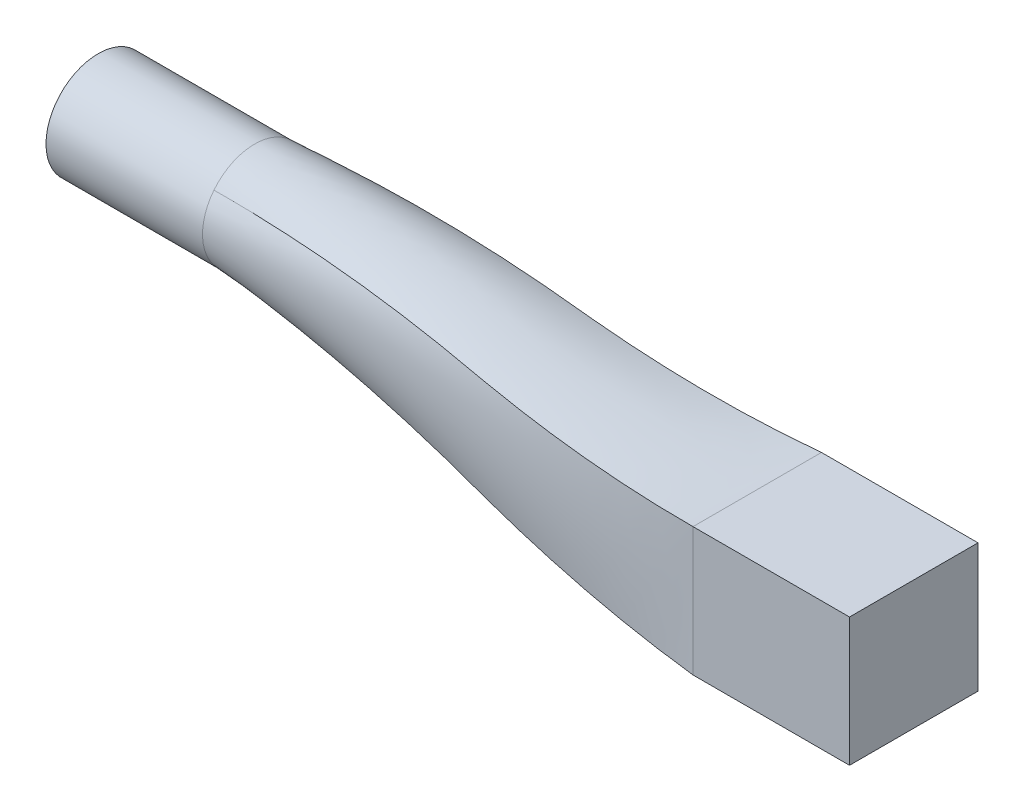
ISO-10303-21;
HEADER;
FILE_DESCRIPTION(('STEP AP214'),'2;1');
FILE_NAME('part.step','',(''),(''),'','','');
FILE_SCHEMA(('AUTOMOTIVE_DESIGN { 1 0 10303 214 1 1 1 1 }'));
ENDSEC;
DATA;
#1=APPLICATION_CONTEXT('core data for automotive mechanical design processes');
#2=APPLICATION_PROTOCOL_DEFINITION('international standard','automotive_design',2000,#1);
#3=PRODUCT_CONTEXT('',#1,'mechanical');
#4=PRODUCT('Part','Part','',(#3));
#5=PRODUCT_RELATED_PRODUCT_CATEGORY('part','',(#4));
#6=PRODUCT_DEFINITION_FORMATION('','',#4);
#7=PRODUCT_DEFINITION_CONTEXT('part definition',#1,'design');
#8=PRODUCT_DEFINITION('design','',#6,#7);
#9=PRODUCT_DEFINITION_SHAPE('','',#8);
#10=(LENGTH_UNIT() NAMED_UNIT(*) SI_UNIT(.MILLI.,.METRE.));
#11=(NAMED_UNIT(*) PLANE_ANGLE_UNIT() SI_UNIT($,.RADIAN.));
#12=(NAMED_UNIT(*) SI_UNIT($,.STERADIAN.) SOLID_ANGLE_UNIT());
#13=UNCERTAINTY_MEASURE_WITH_UNIT(LENGTH_MEASURE(1.E-05),#10,'distance_accuracy_value','');
#14=(GEOMETRIC_REPRESENTATION_CONTEXT(3) GLOBAL_UNCERTAINTY_ASSIGNED_CONTEXT((#13)) GLOBAL_UNIT_ASSIGNED_CONTEXT((#10,
#11,#12)) REPRESENTATION_CONTEXT('',''));
#15=CARTESIAN_POINT('',(0.,0.,0.));
#16=DIRECTION('',(0.,0.,1.));
#17=DIRECTION('',(1.,0.,0.));
#18=AXIS2_PLACEMENT_3D('',#15,#16,#17);
#19=CARTESIAN_POINT('',(1021.37315576226,9.46789488822745,125.73));
#20=CARTESIAN_POINT('',(869.226053043045,1.69605899662091,118.667809974565));
#21=CARTESIAN_POINT('',(717.318679962298,10.4442464754096,111.605619949131));
#22=CARTESIAN_POINT('',(393.85544304639,64.742678185285,96.2732707473336));
#23=CARTESIAN_POINT('',(215.92105118721,74.697777747955,88.0031115709713));
#24=CARTESIAN_POINT('',(37.7577690383184,65.0138389138323,79.732952394609));
#25=CARTESIAN_POINT('',(1021.37315576226,9.46789488822746,114.726095999935));
#26=CARTESIAN_POINT('',(869.226053043045,2.56991933839645,108.654310073217));
#27=CARTESIAN_POINT('',(717.318679962298,12.1919671589607,102.582524146498));
#28=CARTESIAN_POINT('',(393.85544304639,68.3875910805225,89.4003891753731));
#29=CARTESIAN_POINT('',(215.921051187211,79.3660225131033,82.2900401309673));
#30=CARTESIAN_POINT('',(37.7577690383184,70.7054155488915,75.1796910865616));
#31=CARTESIAN_POINT('',(1021.37315576226,9.46789488822746,93.2899023629017));
#32=CARTESIAN_POINT('',(869.226053043046,4.20482678057518,88.8924909485093));
#33=CARTESIAN_POINT('',(717.318679962299,15.4617820433182,84.4950795341169));
#34=CARTESIAN_POINT('',(393.85544304639,75.2068674953431,74.9480909729756));
#35=CARTESIAN_POINT('',(215.921051187211,88.0998530162083,69.7985138262266));
#36=CARTESIAN_POINT('',(37.7577690383183,81.353800140281,64.6489366794776));
#37=CARTESIAN_POINT('',(1021.37315576226,9.46789488822747,67.2687703282233));
#38=CARTESIAN_POINT('',(869.226053043045,5.79694830069594,64.3707141628556));
#39=CARTESIAN_POINT('',(717.318679962298,18.6460250835597,61.4726579974879));
#40=CARTESIAN_POINT('',(393.85544304639,81.8476818017599,55.1808407320494));
#41=CARTESIAN_POINT('',(215.92105118721,96.6051170686796,51.7870796319785));
#42=CARTESIAN_POINT('',(37.7577690383184,91.7235139388067,48.3933185319076));
#43=CARTESIAN_POINT('',(1021.37315576226,9.46789488822747,46.6247399734059));
#44=CARTESIAN_POINT('',(869.226053043045,6.71549396971209,44.7015810673591));
#45=CARTESIAN_POINT('',(717.318679962298,20.483116421592,42.7784221613122));
#46=CARTESIAN_POINT('',(393.85544304639,85.6789793144252,38.6031530433955));
#47=CARTESIAN_POINT('',(215.92105118721,101.512075086962,36.3510428315258));
#48=CARTESIAN_POINT('',(37.7577690383184,97.7061324627059,34.098932619656));
#49=CARTESIAN_POINT('',(1021.37315576226,9.46789488822747,31.1622427577088));
#50=CARTESIAN_POINT('',(869.226053043045,7.21450020940481,29.8971548567502));
#51=CARTESIAN_POINT('',(717.318679962298,21.4811289009774,28.6320669557916));
#52=CARTESIAN_POINT('',(393.85544304639,87.7603579866332,25.8855011739862));
#53=CARTESIAN_POINT('',(215.92105118721,104.1778137123,24.4040232931395));
#54=CARTESIAN_POINT('',(37.7577690383184,100.956231041174,22.9225454122928));
#55=CARTESIAN_POINT('',(1021.37315576226,9.46789488822748,15.6543590063811));
#56=CARTESIAN_POINT('',(869.226053043045,7.51403559640918,15.0135671191708));
#57=CARTESIAN_POINT('',(717.318679962298,22.0801996749861,14.3727752319605));
#58=CARTESIAN_POINT('',(393.85544304639,89.0097342799364,12.9815856795693));
#59=CARTESIAN_POINT('',(215.92105118721,105.777960137893,12.2311880143883));
#60=CARTESIAN_POINT('',(37.7577690383184,102.907147599057,11.4807903492074));
#61=CARTESIAN_POINT('',(1021.37315576226,9.46789488822748,5.23875000000003));
#62=CARTESIAN_POINT('',(869.226053043045,7.57979946099008,5.01973399129957));
#63=CARTESIAN_POINT('',(717.318679962298,22.2117274041479,4.80071798259912));
#64=CARTESIAN_POINT('',(393.85544304639,89.284038475461,4.32522384918086));
#65=CARTESIAN_POINT('',(215.92105118721,106.129276935199,4.06874572446306));
#66=CARTESIAN_POINT('',(37.7577690383184,103.335476998145,3.81226759974525));
#67=CARTESIAN_POINT('',(1021.37315576226,9.46789488822748,-5.23875));
#68=CARTESIAN_POINT('',(869.226053043045,7.57979946099008,-5.01973399129955));
#69=CARTESIAN_POINT('',(717.318679962298,22.2117274041479,-4.8007179825991));
#70=CARTESIAN_POINT('',(393.85544304639,89.2840384754609,-4.32522384918085));
#71=CARTESIAN_POINT('',(215.92105118721,106.129276935199,-4.06874572446304));
#72=CARTESIAN_POINT('',(37.7577690383184,103.335476998145,-3.81226759974524));
#73=CARTESIAN_POINT('',(1021.37315576226,9.46789488822748,-15.654359006381));
#74=CARTESIAN_POINT('',(869.226053043045,7.51403559640918,-15.0135671191708));
#75=CARTESIAN_POINT('',(717.318679962298,22.0801996749861,-14.3727752319605));
#76=CARTESIAN_POINT('',(393.85544304639,89.0097342799364,-12.9815856795693));
#77=CARTESIAN_POINT('',(215.92105118721,105.777960137893,-12.2311880143883));
#78=CARTESIAN_POINT('',(37.7577690383184,102.907147599057,-11.4807903492073));
#79=CARTESIAN_POINT('',(1021.37315576226,9.46789488822748,-31.1622427577088));
#80=CARTESIAN_POINT('',(869.226053043045,7.21450020940484,-29.8971548567502));
#81=CARTESIAN_POINT('',(717.318679962298,21.4811289009774,-28.6320669557916));
#82=CARTESIAN_POINT('',(393.85544304639,87.7603579866333,-25.8855011739863));
#83=CARTESIAN_POINT('',(215.92105118721,104.1778137123,-24.4040232931396));
#84=CARTESIAN_POINT('',(37.7577690383184,100.956231041174,-22.9225454122929));
#85=CARTESIAN_POINT('',(1021.37315576226,9.46789488822749,-46.6247399734059));
#86=CARTESIAN_POINT('',(869.226053043045,6.71549396971209,-44.701581067359));
#87=CARTESIAN_POINT('',(717.318679962298,20.4831164215919,-42.7784221613121));
#88=CARTESIAN_POINT('',(393.85544304639,85.6789793144252,-38.6031530433955));
#89=CARTESIAN_POINT('',(215.92105118721,101.512075086962,-36.3510428315257));
#90=CARTESIAN_POINT('',(37.7577690383184,97.7061324627059,-34.0989326196559));
#91=CARTESIAN_POINT('',(1021.37315576226,9.4678948882275,-67.2687703282233));
#92=CARTESIAN_POINT('',(869.226053043045,5.79694830069598,-64.3707141628556));
#93=CARTESIAN_POINT('',(717.318679962298,18.6460250835597,-61.472657997488));
#94=CARTESIAN_POINT('',(393.85544304639,81.84768180176,-55.1808407320494));
#95=CARTESIAN_POINT('',(215.921051187211,96.6051170686797,-51.7870796319786));
#96=CARTESIAN_POINT('',(37.7577690383184,91.7235139388069,-48.3933185319077));
#97=CARTESIAN_POINT('',(1021.37315576226,9.46789488822749,-93.2899023629016));
#98=CARTESIAN_POINT('',(869.226053043044,4.2048267805752,-88.8924909485093));
#99=CARTESIAN_POINT('',(717.318679962297,15.4617820433182,-84.4950795341169));
#100=CARTESIAN_POINT('',(393.855443046389,75.2068674953431,-74.9480909729755));
#101=CARTESIAN_POINT('',(215.92105118721,88.0998530162083,-69.7985138262265));
#102=CARTESIAN_POINT('',(37.7577690383183,81.3538001402809,-64.6489366794775));
#103=CARTESIAN_POINT('',(1021.37315576226,9.4678948882275,-114.726095999935));
#104=CARTESIAN_POINT('',(869.226053043045,2.56991933839648,-108.654310073217));
#105=CARTESIAN_POINT('',(717.318679962298,12.1919671589607,-102.582524146498));
#106=CARTESIAN_POINT('',(393.85544304639,68.3875910805225,-89.400389175373));
#107=CARTESIAN_POINT('',(215.92105118721,79.3660225131033,-82.2900401309673));
#108=CARTESIAN_POINT('',(37.7577690383184,70.7054155488916,-75.1796910865615));
#109=CARTESIAN_POINT('',(1021.37315576226,9.46789488822752,-125.73));
#110=CARTESIAN_POINT('',(869.226053043045,1.69605899662097,-118.667809974565));
#111=CARTESIAN_POINT('',(717.318679962298,10.4442464754097,-111.605619949131));
#112=CARTESIAN_POINT('',(393.85544304639,64.7426781852851,-96.2732707473335));
#113=CARTESIAN_POINT('',(215.92105118721,74.697777747955,-88.0031115709712));
#114=CARTESIAN_POINT('',(37.7577690383184,65.0138389138323,-79.7329523946089));
#115=B_SPLINE_SURFACE_WITH_KNOTS('',3,3,((#19,#20,#21,#22,#23,#24),(#25,#26,#27,#28,#29,#30),
(#31,#32,#33,#34,#35,#36),(#37,#38,#39,#40,#41,#42),(#43,#44,#45,#46,#47,#48),(#49,#50,#51,#52,
#53,#54),(#55,#56,#57,#58,#59,#60),(#61,#62,#63,#64,#65,#66),(#67,#68,#69,#70,#71,#72),(#73,#74,
#75,#76,#77,#78),(#79,#80,#81,#82,#83,#84),(#85,#86,#87,#88,#89,#90),(#91,#92,#93,#94,#95,#96),
(#97,#98,#99,#100,#101,#102),(#103,#104,#105,#106,#107,#108),(#109,#110,#111,#112,#113,#114)),
.UNSPECIFIED.,.F.,.F.,.F.,(4,1,1,1,1,1,2,1,1,1,1,1,4),(4,2,4),(0.732388356261361,
0.765839811728691,0.799291267196021,0.816016994929686,0.832742722663351,0.849468450397016,
0.866194178130681,0.882919905864346,0.899645633598011,0.916371361331676,0.93309708906534,
0.96654854453267,1.),(0.,0.460607173270421,1.),.UNSPECIFIED.);
#116=DIRECTION('',(0.,0.,1.));
#117=VECTOR('',#116,1.);
#118=CARTESIAN_POINT('',(1021.37315576226,9.46789488822745,125.73));
#119=LINE('',#118,#117);
#120=CARTESIAN_POINT('',(1021.37315576226,9.46789488822752,-125.73));
#121=VERTEX_POINT('',#120);
#122=CARTESIAN_POINT('',(1021.37315576226,9.46789488822745,125.73));
#123=VERTEX_POINT('',#122);
#124=EDGE_CURVE('E209',#121,#123,#119,.T.);
#125=CARTESIAN_POINT('',(1021.37315576226,9.46789488822752,-125.73));
#126=CARTESIAN_POINT('',(869.226053043045,1.69605899662097,-118.667809974565));
#127=CARTESIAN_POINT('',(717.318679962298,10.4442464754097,-111.605619949131));
#128=CARTESIAN_POINT('',(393.85544304639,64.7426781852851,-96.2732707473335));
#129=CARTESIAN_POINT('',(215.92105118721,74.697777747955,-88.0031115709712));
#130=CARTESIAN_POINT('',(37.7577690383184,65.0138389138323,-79.7329523946089));
#131=B_SPLINE_CURVE_WITH_KNOTS('',3,(#125,#126,#127,#128,#129,#130),.UNSPECIFIED.,.F.,.F.,(4,2,
4),(0.,0.460607173270421,1.),.UNSPECIFIED.);
#132=CARTESIAN_POINT('',(37.7577690383183,65.0141999016754,-79.7334037330846));
#133=VERTEX_POINT('',#132);
#134=EDGE_CURVE('E375',#121,#133,#131,.T.);
#135=CARTESIAN_POINT('',(37.7577690383184,1.22747699814517,0.));
#136=DIRECTION('',(-1.,0.,0.));
#137=DIRECTION('',(0.,0.,1.));
#138=AXIS2_PLACEMENT_3D('',#135,#136,#137);
#139=CIRCLE('',#138,102.108);
#140=CARTESIAN_POINT('',(37.7577690383183,65.0141969914088,79.733400107363));
#141=VERTEX_POINT('',#140);
#142=EDGE_CURVE('E13',#141,#133,#139,.T.);
#143=CARTESIAN_POINT('',(1021.37315576226,9.46789488822745,125.73));
#144=CARTESIAN_POINT('',(869.226053043045,1.69605899662091,118.667809974565));
#145=CARTESIAN_POINT('',(717.318679962298,10.4442464754096,111.605619949131));
#146=CARTESIAN_POINT('',(393.85544304639,64.742678185285,96.2732707473336));
#147=CARTESIAN_POINT('',(215.92105118721,74.697777747955,88.0031115709713));
#148=CARTESIAN_POINT('',(37.7577690383184,65.0138389138323,79.732952394609));
#149=B_SPLINE_CURVE_WITH_KNOTS('',3,(#143,#144,#145,#146,#147,#148),.UNSPECIFIED.,.F.,.F.,(4,2,
4),(0.,0.460607173270421,1.),.UNSPECIFIED.);
#150=EDGE_CURVE('E370',#123,#141,#149,.T.);
#151=ORIENTED_EDGE('',*,*,#124,.F.);
#152=ORIENTED_EDGE('',*,*,#134,.T.);
#153=ORIENTED_EDGE('',*,*,#142,.F.);
#154=ORIENTED_EDGE('',*,*,#150,.F.);
#155=EDGE_LOOP('',(#151,#152,#153,#154));
#156=FACE_BOUND('',#155,.T.);
#157=ADVANCED_FACE('F115',(#156),#115,.T.);
#158=CARTESIAN_POINT('',(1021.37315576226,-241.992105111773,125.73));
#159=CARTESIAN_POINT('',(869.226053043045,-232.992911450681,116.462268723041));
#160=CARTESIAN_POINT('',(717.318679962298,-207.473694419194,107.194537446083));
#161=CARTESIAN_POINT('',(393.85544304639,-116.764562820257,87.0738536730629));
#162=CARTESIAN_POINT('',(215.92105118721,-87.1697929212242,76.2209011770018));
#163=CARTESIAN_POINT('',(37.7577690383184,-77.2140614189837,65.3679486809407));
#164=CARTESIAN_POINT('',(1021.37315576226,-231.514605111773,125.73));
#165=CARTESIAN_POINT('',(869.226053043045,-223.475569184842,117.240484105224));
#166=CARTESIAN_POINT('',(717.318679962298,-198.916509887516,108.750968210449));
#167=CARTESIAN_POINT('',(393.85544304639,-110.291926228516,90.3198269095048));
#168=CARTESIAN_POINT('',(215.92105118721,-81.8215465352591,80.3782015033363));
#169=CARTESIAN_POINT('',(37.7577690383184,-72.9902052387945,70.4365760971678));
#170=CARTESIAN_POINT('',(1021.37315576226,-210.559605111773,125.73));
#171=CARTESIAN_POINT('',(869.226053043045,-204.289612272191,118.670824649608));
#172=CARTESIAN_POINT('',(717.318679962298,-181.499596062214,111.611649299217));
#173=CARTESIAN_POINT('',(393.85544304639,-96.7156887756388,96.285845099795));
#174=CARTESIAN_POINT('',(215.92105118721,-70.3169423674572,88.0192162507648));
#175=CARTESIAN_POINT('',(37.7577690383184,-63.5572343560682,79.7525874017347));
#176=CARTESIAN_POINT('',(1021.37315576226,-179.127105111773,125.73));
#177=CARTESIAN_POINT('',(869.226053043045,-175.137961616093,120.357579315639));
#178=CARTESIAN_POINT('',(717.318679962298,-154.628794750018,114.985158631278));
#179=CARTESIAN_POINT('',(393.85544304639,-74.796719471849,103.321378742191));
#180=CARTESIAN_POINT('',(215.92105118721,-51.0689557281716,97.030019537465));
#181=CARTESIAN_POINT('',(37.7577690383184,-46.9802303812868,90.7386603327387));
#182=CARTESIAN_POINT('',(1021.37315576226,-147.694605111773,125.73));
#183=CARTESIAN_POINT('',(869.226053043045,-145.70909192138,121.522482711295));
#184=CARTESIAN_POINT('',(717.318679962298,-127.203555360593,117.314965422591));
#185=CARTESIAN_POINT('',(393.85544304639,-51.7214564213965,108.180246006846));
#186=CARTESIAN_POINT('',(215.92105118721,-30.3400387114043,103.253043879806));
#187=CARTESIAN_POINT('',(37.7577690383183,-28.5976593982048,98.3258417527663));
#188=CARTESIAN_POINT('',(1021.37315576226,-116.262105111772,125.73));
#189=CARTESIAN_POINT('',(869.226053043045,-116.108663276148,122.121846326112));
#190=CARTESIAN_POINT('',(717.318679962298,-99.4351980701293,118.513692652223));
#191=CARTESIAN_POINT('',(393.85544304639,-27.9306128586505,110.680220046338));
#192=CARTESIAN_POINT('',(215.92105118721,-8.69463752160761,106.454901114341));
#193=CARTESIAN_POINT('',(37.7577690383184,-9.09770058135737,102.229582182343));
#194=CARTESIAN_POINT('',(1021.37315576226,-84.8296051117725,125.73));
#195=CARTESIAN_POINT('',(869.226053043045,-86.4488513176859,122.133255762567));
#196=CARTESIAN_POINT('',(717.318679962298,-71.5480741532042,118.536511525134));
#197=CARTESIAN_POINT('',(393.85544304639,-3.89207868241689,110.727809346453));
#198=CARTESIAN_POINT('',(215.92105118721,13.2679949554719,106.515851405205));
#199=CARTESIAN_POINT('',(37.7577690383184,10.7890301965681,102.303893463957));
#200=CARTESIAN_POINT('',(1021.37315576226,-53.3971051117726,125.73));
#201=CARTESIAN_POINT('',(869.226053043045,-56.8440481739013,121.55624209655));
#202=CARTESIAN_POINT('',(717.318679962298,-43.7709678656349,117.3824841931));
#203=CARTESIAN_POINT('',(393.85544304639,19.9170111210882,108.321058002501));
#204=CARTESIAN_POINT('',(215.921051187211,34.9367651311281,103.433389715353));
#205=CARTESIAN_POINT('',(37.7577690383184,30.3174807443753,98.5457214282047));
#206=CARTESIAN_POINT('',(1021.37315576226,-21.9646051117726,125.73));
#207=CARTESIAN_POINT('',(869.226053043045,-27.4065159830382,120.412483715453));
#208=CARTESIAN_POINT('',(717.318679962298,-16.3284034839085,115.094967430906));
#209=CARTESIAN_POINT('',(393.85544304639,43.0284058534753,103.550387595575));
#210=CARTESIAN_POINT('',(215.92105118721,55.7119580233127,97.32332404479));
#211=CARTESIAN_POINT('',(37.7577690383184,48.7564717963574,91.0962604940051));
#212=CARTESIAN_POINT('',(1021.37315576226,-1.00960511177257,125.73));
#213=CARTESIAN_POINT('',(869.226053043045,-7.9637978996126,119.30063193367));
#214=CARTESIAN_POINT('',(717.318679962298,1.60203268294263,112.871263867339));
#215=CARTESIAN_POINT('',(393.85544304639,57.675606316816,98.9128011263439));
#216=CARTESIAN_POINT('',(215.92105118721,68.5882046997174,91.3837064516789));
#217=CARTESIAN_POINT('',(37.7577690383184,59.8617646858261,83.8546117770139));
#218=CARTESIAN_POINT('',(1021.37315576226,9.46789488822745,125.73));
#219=CARTESIAN_POINT('',(869.226053043045,1.69605899662091,118.667809974565));
#220=CARTESIAN_POINT('',(717.318679962298,10.4442464754096,111.605619949131));
#221=CARTESIAN_POINT('',(393.85544304639,64.742678185285,96.2732707473336));
#222=CARTESIAN_POINT('',(215.92105118721,74.697777747955,88.0031115709713));
#223=CARTESIAN_POINT('',(37.7577690383184,65.0138389138323,79.732952394609));
#224=B_SPLINE_SURFACE_WITH_KNOTS('',3,3,((#158,#159,#160,#161,#162,#163),(#164,#165,#166,#167,
#168,#169),(#170,#171,#172,#173,#174,#175),(#176,#177,#178,#179,#180,#181),(#182,#183,#184,#185,
#186,#187),(#188,#189,#190,#191,#192,#193),(#194,#195,#196,#197,#198,#199),(#200,#201,#202,#203,
#204,#205),(#206,#207,#208,#209,#210,#211),(#212,#213,#214,#215,#216,#217),(#218,#219,#220,#221,
#222,#223)),.UNSPECIFIED.,.F.,.F.,.F.,(4,1,1,1,1,1,1,1,4),(4,2,4),(0.483979693536605,
0.515030776377199,0.546081859217794,0.577132942058388,0.608184024898983,0.639235107739578,
0.670286190580172,0.701337273420767,0.732388356261361),(0.,0.460607173270421,1.),.UNSPECIFIED.);
#225=DIRECTION('',(0.,-1.,0.));
#226=VECTOR('',#225,1.);
#227=CARTESIAN_POINT('',(1021.37315576226,9.46789488822745,125.73));
#228=LINE('',#227,#226);
#229=CARTESIAN_POINT('',(1021.37315576226,-241.992105111773,125.73));
#230=VERTEX_POINT('',#229);
#231=EDGE_CURVE('E341',#123,#230,#228,.T.);
#232=CARTESIAN_POINT('',(37.7577690383183,-77.2145140271889,65.3683259044379));
#233=VERTEX_POINT('',#232);
#234=EDGE_CURVE('E144',#233,#141,#139,.T.);
#235=CARTESIAN_POINT('',(1021.37315576226,-241.992105111773,125.73));
#236=CARTESIAN_POINT('',(869.226053043045,-232.992911450681,116.462268723041));
#237=CARTESIAN_POINT('',(717.318679962298,-207.473694419194,107.194537446083));
#238=CARTESIAN_POINT('',(393.85544304639,-116.764562820257,87.0738536730629));
#239=CARTESIAN_POINT('',(215.92105118721,-87.1697929212242,76.2209011770018));
#240=CARTESIAN_POINT('',(37.7577690383184,-77.2140614189837,65.3679486809407));
#241=B_SPLINE_CURVE_WITH_KNOTS('',3,(#235,#236,#237,#238,#239,#240),.UNSPECIFIED.,.F.,.F.,(4,2,
4),(0.,0.460607173270421,1.),.UNSPECIFIED.);
#242=EDGE_CURVE('E371',#230,#233,#241,.T.);
#243=ORIENTED_EDGE('',*,*,#231,.F.);
#244=ORIENTED_EDGE('',*,*,#150,.T.);
#245=ORIENTED_EDGE('',*,*,#234,.F.);
#246=ORIENTED_EDGE('',*,*,#242,.F.);
#247=EDGE_LOOP('',(#243,#244,#245,#246));
#248=FACE_BOUND('',#247,.T.);
#249=ADVANCED_FACE('F279',(#248),#224,.T.);
#250=CARTESIAN_POINT('',(1021.37315576226,-241.992105111772,-125.73));
#251=CARTESIAN_POINT('',(869.226053043045,-232.992911450681,-116.462268723041));
#252=CARTESIAN_POINT('',(717.318679962298,-207.473694419194,-107.194537446083));
#253=CARTESIAN_POINT('',(393.85544304639,-116.764562820257,-87.073853673063));
#254=CARTESIAN_POINT('',(215.92105118721,-87.1697929212241,-76.2209011770019));
#255=CARTESIAN_POINT('',(37.7577690383184,-77.2140614189836,-65.3679486809408));
#256=CARTESIAN_POINT('',(1021.37315576226,-241.992105111772,-115.2525));
#257=CARTESIAN_POINT('',(869.226053043045,-233.573962481939,-106.896178038178));
#258=CARTESIAN_POINT('',(717.318679962298,-208.63579648171,-98.5398560763568));
#259=CARTESIAN_POINT('',(393.85544304639,-119.188154205948,-80.3978851155275));
#260=CARTESIAN_POINT('',(215.92105118721,-90.2738225988315,-70.6122361165199));
#261=CARTESIAN_POINT('',(37.7577690383184,-80.9985293885073,-60.8265871175123));
#262=CARTESIAN_POINT('',(1021.37315576226,-241.992105111772,-94.2975));
#263=CARTESIAN_POINT('',(869.226053043045,-234.614675419994,-87.6628562361966));
#264=CARTESIAN_POINT('',(717.318679962298,-210.71722235782,-81.0282124723932));
#265=CARTESIAN_POINT('',(393.85544304639,-123.529017186924,-66.6240864647676));
#266=CARTESIAN_POINT('',(215.921051187211,-95.8334097466188,-58.8546042209453));
#267=CARTESIAN_POINT('',(37.7577690383185,-87.7768407031061,-51.0851219771231));
#268=CARTESIAN_POINT('',(1021.37315576226,-241.992105111772,-62.8650000000001));
#269=CARTESIAN_POINT('',(869.226053043045,-235.764495181031,-58.5768019647471));
#270=CARTESIAN_POINT('',(717.318679962298,-213.016861879895,-54.2886039294941));
#271=CARTESIAN_POINT('',(393.855443046389,-128.324969896815,-44.9787227897677));
#272=CARTESIAN_POINT('',(215.92105118721,-101.975855883288,-39.9570396852942));
#273=CARTESIAN_POINT('',(37.7577690383182,-95.2657802665541,-34.9353565808208));
#274=CARTESIAN_POINT('',(1021.37315576226,-241.992105111772,-31.4325000000001));
#275=CARTESIAN_POINT('',(869.226053043045,-236.468543968054,-29.3293728425583));
#276=CARTESIAN_POINT('',(717.318679962298,-214.424959453941,-27.2262456851166));
#277=CARTESIAN_POINT('',(393.85544304639,-131.261590750305,-22.6602569652513));
#278=CARTESIAN_POINT('',(215.921051187211,-105.7369512292,-20.1973954028279));
#279=CARTESIAN_POINT('',(37.7577690383186,-99.8513501048871,-17.7345338404044));
#280=CARTESIAN_POINT('',(1021.37315576226,-241.992105111772,0.));
#281=CARTESIAN_POINT('',(869.226053043045,-236.70559491699,0.));
#282=CARTESIAN_POINT('',(717.318679962298,-214.899061351813,0.));
#283=CARTESIAN_POINT('',(393.85544304639,-132.25034149147,0.));
#284=CARTESIAN_POINT('',(215.92105118721,-107.003299864721,-1.0761946755672E-13));
#285=CARTESIAN_POINT('',(37.7577690383182,-101.395296634765,-1.23165366794353E-13));
#286=CARTESIAN_POINT('',(1021.37315576226,-241.992105111772,31.4324999999999));
#287=CARTESIAN_POINT('',(869.226053043045,-236.468543968054,29.3293728425582));
#288=CARTESIAN_POINT('',(717.318679962298,-214.424959453941,27.2262456851164));
#289=CARTESIAN_POINT('',(393.85544304639,-131.261590750306,22.6602569652512));
#290=CARTESIAN_POINT('',(215.921051187211,-105.7369512292,20.1973954028278));
#291=CARTESIAN_POINT('',(37.7577690383185,-99.8513501048873,17.7345338404043));
#292=CARTESIAN_POINT('',(1021.37315576226,-241.992105111772,62.8649999999999));
#293=CARTESIAN_POINT('',(869.226053043045,-235.764495181031,58.5768019647469));
#294=CARTESIAN_POINT('',(717.318679962298,-213.016861879895,54.2886039294939));
#295=CARTESIAN_POINT('',(393.855443046389,-128.324969896815,44.9787227897675));
#296=CARTESIAN_POINT('',(215.92105118721,-101.975855883288,39.9570396852941));
#297=CARTESIAN_POINT('',(37.7577690383183,-95.2657802665542,34.9353565808207));
#298=CARTESIAN_POINT('',(1021.37315576226,-241.992105111773,94.2974999999999));
#299=CARTESIAN_POINT('',(869.226053043045,-234.614675419994,87.6628562361965));
#300=CARTESIAN_POINT('',(717.318679962298,-210.71722235782,81.0282124723931));
#301=CARTESIAN_POINT('',(393.85544304639,-123.529017186924,66.6240864647674));
#302=CARTESIAN_POINT('',(215.92105118721,-95.8334097466188,58.8546042209452));
#303=CARTESIAN_POINT('',(37.7577690383185,-87.7768407031062,51.0851219771229));
#304=CARTESIAN_POINT('',(1021.37315576226,-241.992105111773,115.2525));
#305=CARTESIAN_POINT('',(869.226053043045,-233.573962481939,106.896178038178));
#306=CARTESIAN_POINT('',(717.318679962298,-208.635796481711,98.5398560763567));
#307=CARTESIAN_POINT('',(393.85544304639,-119.188154205948,80.3978851155275));
#308=CARTESIAN_POINT('',(215.92105118721,-90.2738225988316,70.6122361165198));
#309=CARTESIAN_POINT('',(37.7577690383184,-80.9985293885074,60.8265871175122));
#310=CARTESIAN_POINT('',(1021.37315576226,-241.992105111773,125.73));
#311=CARTESIAN_POINT('',(869.226053043045,-232.992911450681,116.462268723041));
#312=CARTESIAN_POINT('',(717.318679962298,-207.473694419194,107.194537446083));
#313=CARTESIAN_POINT('',(393.85544304639,-116.764562820257,87.0738536730629));
#314=CARTESIAN_POINT('',(215.92105118721,-87.1697929212242,76.2209011770018));
#315=CARTESIAN_POINT('',(37.7577690383184,-77.2140614189837,65.3679486809407));
#316=B_SPLINE_SURFACE_WITH_KNOTS('',3,3,((#250,#251,#252,#253,#254,#255),(#256,#257,#258,#259,
#260,#261),(#262,#263,#264,#265,#266,#267),(#268,#269,#270,#271,#272,#273),(#274,#275,#276,#277,
#278,#279),(#280,#281,#282,#283,#284,#285),(#286,#287,#288,#289,#290,#291),(#292,#293,#294,#295,
#296,#297),(#298,#299,#300,#301,#302,#303),(#304,#305,#306,#307,#308,#309),(#310,#311,#312,#313,
#314,#315)),.UNSPECIFIED.,.F.,.F.,.F.,(4,1,1,1,1,1,1,1,4),(4,2,4),(0.248408662724757,
0.277855041576238,0.307301420427719,0.3367477992792,0.366194178130681,0.395640556982162,
0.425086935833643,0.454533314685124,0.483979693536605),(0.,0.460607173270421,1.),.UNSPECIFIED.);
#317=DIRECTION('',(0.,0.,-1.));
#318=VECTOR('',#317,1.);
#319=CARTESIAN_POINT('',(1021.37315576226,-241.992105111773,125.73));
#320=LINE('',#319,#318);
#321=CARTESIAN_POINT('',(1021.37315576226,-241.992105111773,-125.73));
#322=VERTEX_POINT('',#321);
#323=EDGE_CURVE('E262',#230,#322,#320,.T.);
#324=CARTESIAN_POINT('',(37.7577690383183,-77.2145118488338,-65.3683241000228));
#325=VERTEX_POINT('',#324);
#326=EDGE_CURVE('E135',#325,#233,#139,.T.);
#327=CARTESIAN_POINT('',(1021.37315576226,-241.992105111772,-125.73));
#328=CARTESIAN_POINT('',(869.226053043045,-232.992911450681,-116.462268723041));
#329=CARTESIAN_POINT('',(717.318679962298,-207.473694419194,-107.194537446083));
#330=CARTESIAN_POINT('',(393.85544304639,-116.764562820257,-87.073853673063));
#331=CARTESIAN_POINT('',(215.92105118721,-87.1697929212241,-76.2209011770019));
#332=CARTESIAN_POINT('',(37.7577690383184,-77.2140614189836,-65.3679486809408));
#333=B_SPLINE_CURVE_WITH_KNOTS('',3,(#327,#328,#329,#330,#331,#332),.UNSPECIFIED.,.F.,.F.,(4,2,
4),(0.,0.460607173270421,1.),.UNSPECIFIED.);
#334=EDGE_CURVE('E267',#322,#325,#333,.T.);
#335=ORIENTED_EDGE('',*,*,#323,.F.);
#336=ORIENTED_EDGE('',*,*,#242,.T.);
#337=ORIENTED_EDGE('',*,*,#326,.F.);
#338=ORIENTED_EDGE('',*,*,#334,.F.);
#339=EDGE_LOOP('',(#335,#336,#337,#338));
#340=FACE_BOUND('',#339,.T.);
#341=ADVANCED_FACE('F269',(#340),#316,.T.);
#342=CARTESIAN_POINT('',(1021.37315576226,9.46789488822752,-125.73));
#343=CARTESIAN_POINT('',(869.226053043045,1.69605899662097,-118.667809974565));
#344=CARTESIAN_POINT('',(717.318679962298,10.4442464754097,-111.605619949131));
#345=CARTESIAN_POINT('',(393.85544304639,64.7426781852851,-96.2732707473335));
#346=CARTESIAN_POINT('',(215.92105118721,74.697777747955,-88.0031115709712));
#347=CARTESIAN_POINT('',(37.7577690383184,65.0138389138323,-79.7329523946089));
#348=CARTESIAN_POINT('',(1021.37315576226,-1.00960511177247,-125.73));
#349=CARTESIAN_POINT('',(869.226053043045,-7.9637978996125,-119.30063193367));
#350=CARTESIAN_POINT('',(717.318679962298,1.60203268294272,-112.871263867339));
#351=CARTESIAN_POINT('',(393.85544304639,57.6756063168161,-98.9128011263439));
#352=CARTESIAN_POINT('',(215.92105118721,68.5882046997174,-91.3837064516788));
#353=CARTESIAN_POINT('',(37.7577690383184,59.8617646858262,-83.8546117770138));
#354=CARTESIAN_POINT('',(1021.37315576226,-21.9646051117725,-125.73));
#355=CARTESIAN_POINT('',(869.226053043045,-27.4065159830381,-120.412483715453));
#356=CARTESIAN_POINT('',(717.318679962298,-16.3284034839084,-115.094967430906));
#357=CARTESIAN_POINT('',(393.85544304639,43.0284058534754,-103.550387595575));
#358=CARTESIAN_POINT('',(215.921051187211,55.7119580233128,-97.3233240447897));
#359=CARTESIAN_POINT('',(37.7577690383184,48.7564717963576,-91.0962604940048));
#360=CARTESIAN_POINT('',(1021.37315576226,-53.3971051117726,-125.73));
#361=CARTESIAN_POINT('',(869.226053043045,-56.8440481739013,-121.55624209655));
#362=CARTESIAN_POINT('',(717.318679962298,-43.7709678656349,-117.3824841931));
#363=CARTESIAN_POINT('',(393.85544304639,19.9170111210882,-108.321058002502));
#364=CARTESIAN_POINT('',(215.92105118721,34.936765131128,-103.433389715353));
#365=CARTESIAN_POINT('',(37.7577690383183,30.3174807443752,-98.5457214282049));
#366=CARTESIAN_POINT('',(1021.37315576226,-84.8296051117724,-125.73));
#367=CARTESIAN_POINT('',(869.226053043045,-86.4488513176859,-122.133255762567));
#368=CARTESIAN_POINT('',(717.318679962298,-71.5480741532042,-118.536511525134));
#369=CARTESIAN_POINT('',(393.85544304639,-3.89207868241685,-110.727809346453));
#370=CARTESIAN_POINT('',(215.92105118721,13.267994955472,-106.515851405205));
#371=CARTESIAN_POINT('',(37.7577690383183,10.7890301965682,-102.303893463957));
#372=CARTESIAN_POINT('',(1021.37315576226,-116.262105111772,-125.73));
#373=CARTESIAN_POINT('',(869.226053043045,-116.108663276148,-122.121846326112));
#374=CARTESIAN_POINT('',(717.318679962298,-99.4351980701292,-118.513692652224));
#375=CARTESIAN_POINT('',(393.85544304639,-27.9306128586504,-110.680220046338));
#376=CARTESIAN_POINT('',(215.921051187211,-8.69463752160756,-106.454901114341));
#377=CARTESIAN_POINT('',(37.7577690383185,-9.09770058135734,-102.229582182344));
#378=CARTESIAN_POINT('',(1021.37315576226,-147.694605111772,-125.73));
#379=CARTESIAN_POINT('',(869.226053043045,-145.70909192138,-121.522482711295));
#380=CARTESIAN_POINT('',(717.318679962298,-127.203555360593,-117.314965422591));
#381=CARTESIAN_POINT('',(393.85544304639,-51.7214564213964,-108.180246006846));
#382=CARTESIAN_POINT('',(215.92105118721,-30.3400387114042,-103.253043879806));
#383=CARTESIAN_POINT('',(37.7577690383183,-28.5976593982047,-98.3258417527661));
#384=CARTESIAN_POINT('',(1021.37315576226,-179.127105111773,-125.73));
#385=CARTESIAN_POINT('',(869.226053043045,-175.137961616093,-120.357579315639));
#386=CARTESIAN_POINT('',(717.318679962298,-154.628794750018,-114.985158631278));
#387=CARTESIAN_POINT('',(393.85544304639,-74.7967194718489,-103.321378742191));
#388=CARTESIAN_POINT('',(215.921051187211,-51.0689557281715,-97.030019537465));
#389=CARTESIAN_POINT('',(37.7577690383184,-46.9802303812867,-90.7386603327387));
#390=CARTESIAN_POINT('',(1021.37315576226,-210.559605111772,-125.73));
#391=CARTESIAN_POINT('',(869.226053043045,-204.289612272191,-118.670824649608));
#392=CARTESIAN_POINT('',(717.318679962298,-181.499596062214,-111.611649299217));
#393=CARTESIAN_POINT('',(393.85544304639,-96.7156887756387,-96.2858450997951));
#394=CARTESIAN_POINT('',(215.92105118721,-70.316942367457,-88.019216250765));
#395=CARTESIAN_POINT('',(37.7577690383183,-63.557234356068,-79.7525874017349));
#396=CARTESIAN_POINT('',(1021.37315576226,-231.514605111772,-125.73));
#397=CARTESIAN_POINT('',(869.226053043045,-223.475569184842,-117.240484105224));
#398=CARTESIAN_POINT('',(717.318679962298,-198.916509887516,-108.750968210449));
#399=CARTESIAN_POINT('',(393.85544304639,-110.291926228516,-90.3198269095049));
#400=CARTESIAN_POINT('',(215.92105118721,-81.821546535259,-80.3782015033364));
#401=CARTESIAN_POINT('',(37.7577690383184,-72.9902052387944,-70.4365760971678));
#402=CARTESIAN_POINT('',(1021.37315576226,-241.992105111772,-125.73));
#403=CARTESIAN_POINT('',(869.226053043045,-232.992911450681,-116.462268723041));
#404=CARTESIAN_POINT('',(717.318679962298,-207.473694419194,-107.194537446083));
#405=CARTESIAN_POINT('',(393.85544304639,-116.764562820257,-87.073853673063));
#406=CARTESIAN_POINT('',(215.92105118721,-87.1697929212241,-76.2209011770019));
#407=CARTESIAN_POINT('',(37.7577690383184,-77.2140614189836,-65.3679486809408));
#408=B_SPLINE_SURFACE_WITH_KNOTS('',3,3,((#342,#343,#344,#345,#346,#347),(#348,#349,#350,#351,
#352,#353),(#354,#355,#356,#357,#358,#359),(#360,#361,#362,#363,#364,#365),(#366,#367,#368,#369,
#370,#371),(#372,#373,#374,#375,#376,#377),(#378,#379,#380,#381,#382,#383),(#384,#385,#386,#387,
#388,#389),(#390,#391,#392,#393,#394,#395),(#396,#397,#398,#399,#400,#401),(#402,#403,#404,#405,
#406,#407)),.UNSPECIFIED.,.F.,.F.,.F.,(4,1,1,1,1,1,1,1,4),(4,2,4),(0.,0.0310510828405946,
0.0621021656811892,0.0931532485217838,0.124204331362378,0.155255414202973,0.186306497043568,
0.217357579884162,0.248408662724757),(0.,0.460607173270421,1.),.UNSPECIFIED.);
#409=DIRECTION('',(0.,1.,0.));
#410=VECTOR('',#409,1.);
#411=CARTESIAN_POINT('',(1021.37315576226,-241.992105111773,-125.73));
#412=LINE('',#411,#410);
#413=EDGE_CURVE('E121',#322,#121,#412,.T.);
#414=EDGE_CURVE('E127',#133,#325,#139,.T.);
#415=ORIENTED_EDGE('',*,*,#413,.F.);
#416=ORIENTED_EDGE('',*,*,#334,.T.);
#417=ORIENTED_EDGE('',*,*,#414,.F.);
#418=ORIENTED_EDGE('',*,*,#134,.F.);
#419=EDGE_LOOP('',(#415,#416,#417,#418));
#420=FACE_BOUND('',#419,.T.);
#421=ADVANCED_FACE('F235',(#420),#408,.T.);
#422=CARTESIAN_POINT('',(-268.566230961682,1.22747699814517,0.));
#423=DIRECTION('',(1.,0.,0.));
#424=DIRECTION('',(0.,0.,-1.));
#425=AXIS2_PLACEMENT_3D('',#422,#423,#424);
#426=CYLINDRICAL_SURFACE('',#425,102.108);
#427=CARTESIAN_POINT('',(-268.566230961682,1.22747699814517,0.));
#428=DIRECTION('',(-1.,0.,0.));
#429=DIRECTION('',(0.,0.,1.));
#430=AXIS2_PLACEMENT_3D('',#427,#428,#429);
#431=CIRCLE('',#430,102.108);
#432=CARTESIAN_POINT('',(-268.566230961682,1.22747699814517,102.108));
#433=VERTEX_POINT('',#432);
#434=EDGE_CURVE('E201',#433,#433,#431,.T.);
#435=ORIENTED_EDGE('',*,*,#434,.F.);
#436=EDGE_LOOP('',(#435));
#437=FACE_BOUND('',#436,.T.);
#438=ORIENTED_EDGE('',*,*,#142,.T.);
#439=ORIENTED_EDGE('',*,*,#414,.T.);
#440=ORIENTED_EDGE('',*,*,#326,.T.);
#441=ORIENTED_EDGE('',*,*,#234,.T.);
#442=EDGE_LOOP('',(#438,#439,#440,#441));
#443=FACE_BOUND('',#442,.T.);
#444=ADVANCED_FACE('F230',(#437,#443),#426,.T.);
#445=CARTESIAN_POINT('',(-268.566230961682,1.22747699814517,0.));
#446=DIRECTION('',(-1.,0.,0.));
#447=DIRECTION('',(0.,0.,1.));
#448=AXIS2_PLACEMENT_3D('',#445,#446,#447);
#449=PLANE('',#448);
#450=ORIENTED_EDGE('',*,*,#434,.T.);
#451=EDGE_LOOP('',(#450));
#452=FACE_BOUND('',#451,.T.);
#453=ADVANCED_FACE('F225',(#452),#449,.T.);
#454=CARTESIAN_POINT('',(1327.69715576226,-241.992105111773,-125.73));
#455=DIRECTION('',(0.,0.,1.));
#456=DIRECTION('',(0.,-1.,0.));
#457=AXIS2_PLACEMENT_3D('',#454,#455,#456);
#458=PLANE('',#457);
#459=ORIENTED_EDGE('',*,*,#413,.T.);
#460=DIRECTION('',(-1.,0.,0.));
#461=VECTOR('',#460,1.);
#462=CARTESIAN_POINT('',(1327.69715576226,9.4678948882275,-125.73));
#463=LINE('',#462,#461);
#464=CARTESIAN_POINT('',(1327.69715576226,9.4678948882275,-125.73));
#465=VERTEX_POINT('',#464);
#466=EDGE_CURVE('E181',#465,#121,#463,.T.);
#467=ORIENTED_EDGE('',*,*,#466,.F.);
#468=DIRECTION('',(0.,1.,0.));
#469=VECTOR('',#468,1.);
#470=CARTESIAN_POINT('',(1327.69715576226,-241.992105111773,-125.73));
#471=LINE('',#470,#469);
#472=CARTESIAN_POINT('',(1327.69715576226,-241.992105111773,-125.73));
#473=VERTEX_POINT('',#472);
#474=EDGE_CURVE('E188',#473,#465,#471,.T.);
#475=ORIENTED_EDGE('',*,*,#474,.F.);
#476=DIRECTION('',(-1.,0.,0.));
#477=VECTOR('',#476,1.);
#478=CARTESIAN_POINT('',(1327.69715576226,-241.992105111773,-125.73));
#479=LINE('',#478,#477);
#480=EDGE_CURVE('E310',#473,#322,#479,.T.);
#481=ORIENTED_EDGE('',*,*,#480,.T.);
#482=EDGE_LOOP('',(#459,#467,#475,#481));
#483=FACE_BOUND('',#482,.T.);
#484=ADVANCED_FACE('F198',(#483),#458,.F.);
#485=CARTESIAN_POINT('',(1327.69715576226,9.46789488822745,125.73));
#486=DIRECTION('',(0.,-1.,0.));
#487=DIRECTION('',(0.,0.,-1.));
#488=AXIS2_PLACEMENT_3D('',#485,#486,#487);
#489=PLANE('',#488);
#490=ORIENTED_EDGE('',*,*,#124,.T.);
#491=DIRECTION('',(-1.,0.,0.));
#492=VECTOR('',#491,1.);
#493=CARTESIAN_POINT('',(1327.69715576226,9.46789488822745,125.73));
#494=LINE('',#493,#492);
#495=CARTESIAN_POINT('',(1327.69715576226,9.46789488822745,125.73));
#496=VERTEX_POINT('',#495);
#497=EDGE_CURVE('E184',#496,#123,#494,.T.);
#498=ORIENTED_EDGE('',*,*,#497,.F.);
#499=DIRECTION('',(0.,0.,1.));
#500=VECTOR('',#499,1.);
#501=CARTESIAN_POINT('',(1327.69715576226,9.46789488822745,125.73));
#502=LINE('',#501,#500);
#503=EDGE_CURVE('E176',#465,#496,#502,.T.);
#504=ORIENTED_EDGE('',*,*,#503,.F.);
#505=ORIENTED_EDGE('',*,*,#466,.T.);
#506=EDGE_LOOP('',(#490,#498,#504,#505));
#507=FACE_BOUND('',#506,.T.);
#508=ADVANCED_FACE('F179',(#507),#489,.F.);
#509=CARTESIAN_POINT('',(1327.69715576226,9.46789488822745,125.73));
#510=DIRECTION('',(0.,0.,-1.));
#511=DIRECTION('',(0.,1.,0.));
#512=AXIS2_PLACEMENT_3D('',#509,#510,#511);
#513=PLANE('',#512);
#514=ORIENTED_EDGE('',*,*,#231,.T.);
#515=DIRECTION('',(-1.,0.,0.));
#516=VECTOR('',#515,1.);
#517=CARTESIAN_POINT('',(1327.69715576226,-241.992105111773,125.73));
#518=LINE('',#517,#516);
#519=CARTESIAN_POINT('',(1327.69715576226,-241.992105111773,125.73));
#520=VERTEX_POINT('',#519);
#521=EDGE_CURVE('E205',#520,#230,#518,.T.);
#522=ORIENTED_EDGE('',*,*,#521,.F.);
#523=DIRECTION('',(0.,-1.,0.));
#524=VECTOR('',#523,1.);
#525=CARTESIAN_POINT('',(1327.69715576226,9.46789488822745,125.73));
#526=LINE('',#525,#524);
#527=EDGE_CURVE('E187',#496,#520,#526,.T.);
#528=ORIENTED_EDGE('',*,*,#527,.F.);
#529=ORIENTED_EDGE('',*,*,#497,.T.);
#530=EDGE_LOOP('',(#514,#522,#528,#529));
#531=FACE_BOUND('',#530,.T.);
#532=ADVANCED_FACE('F331',(#531),#513,.F.);
#533=CARTESIAN_POINT('',(1327.69715576226,-241.992105111773,125.73));
#534=DIRECTION('',(0.,1.,0.));
#535=DIRECTION('',(0.,0.,1.));
#536=AXIS2_PLACEMENT_3D('',#533,#534,#535);
#537=PLANE('',#536);
#538=ORIENTED_EDGE('',*,*,#323,.T.);
#539=ORIENTED_EDGE('',*,*,#480,.F.);
#540=DIRECTION('',(0.,0.,-1.));
#541=VECTOR('',#540,1.);
#542=CARTESIAN_POINT('',(1327.69715576226,-241.992105111773,125.73));
#543=LINE('',#542,#541);
#544=EDGE_CURVE('E193',#520,#473,#543,.T.);
#545=ORIENTED_EDGE('',*,*,#544,.F.);
#546=ORIENTED_EDGE('',*,*,#521,.T.);
#547=EDGE_LOOP('',(#538,#539,#545,#546));
#548=FACE_BOUND('',#547,.T.);
#549=ADVANCED_FACE('F322',(#548),#537,.F.);
#550=CARTESIAN_POINT('',(1327.69715576226,0.,0.));
#551=DIRECTION('',(-1.,0.,0.));
#552=DIRECTION('',(0.,0.,1.));
#553=AXIS2_PLACEMENT_3D('',#550,#551,#552);
#554=PLANE('',#553);
#555=ORIENTED_EDGE('',*,*,#474,.T.);
#556=ORIENTED_EDGE('',*,*,#503,.T.);
#557=ORIENTED_EDGE('',*,*,#527,.T.);
#558=ORIENTED_EDGE('',*,*,#544,.T.);
#559=EDGE_LOOP('',(#555,#556,#557,#558));
#560=FACE_BOUND('',#559,.T.);
#561=ADVANCED_FACE('F191',(#560),#554,.F.);
#562=CLOSED_SHELL('',(#157,#249,#341,#421,#444,#453,#484,#508,#532,#549,#561));
#563=MANIFOLD_SOLID_BREP('B2',#562);
#564=ADVANCED_BREP_SHAPE_REPRESENTATION('',(#18,#563),#14);
#565=SHAPE_DEFINITION_REPRESENTATION(#9,#564);
ENDSEC;
END-ISO-10303-21;
